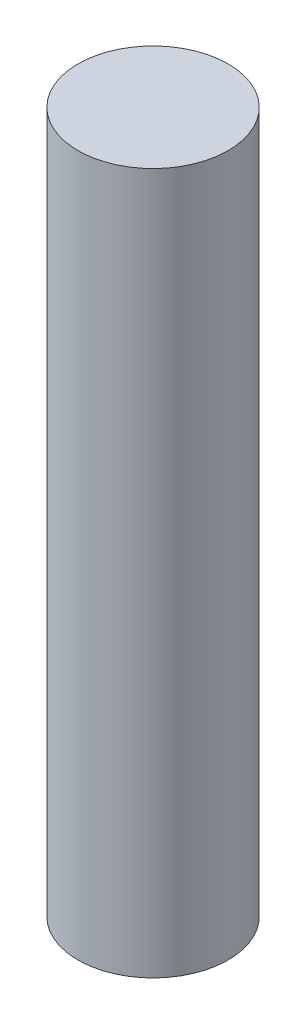
ISO-10303-21;
HEADER;
FILE_DESCRIPTION(('STEP AP214'),'2;1');
FILE_NAME('part.step','',(''),(''),'','','');
FILE_SCHEMA(('AUTOMOTIVE_DESIGN { 1 0 10303 214 1 1 1 1 }'));
ENDSEC;
DATA;
#1=APPLICATION_CONTEXT('core data for automotive mechanical design processes');
#2=APPLICATION_PROTOCOL_DEFINITION('international standard','automotive_design',2000,#1);
#3=PRODUCT_CONTEXT('',#1,'mechanical');
#4=PRODUCT('Part','Part','',(#3));
#5=PRODUCT_RELATED_PRODUCT_CATEGORY('part','',(#4));
#6=PRODUCT_DEFINITION_FORMATION('','',#4);
#7=PRODUCT_DEFINITION_CONTEXT('part definition',#1,'design');
#8=PRODUCT_DEFINITION('design','',#6,#7);
#9=PRODUCT_DEFINITION_SHAPE('','',#8);
#10=(LENGTH_UNIT() NAMED_UNIT(*) SI_UNIT(.MILLI.,.METRE.));
#11=(NAMED_UNIT(*) PLANE_ANGLE_UNIT() SI_UNIT($,.RADIAN.));
#12=(NAMED_UNIT(*) SI_UNIT($,.STERADIAN.) SOLID_ANGLE_UNIT());
#13=UNCERTAINTY_MEASURE_WITH_UNIT(LENGTH_MEASURE(1.E-05),#10,'distance_accuracy_value','');
#14=(GEOMETRIC_REPRESENTATION_CONTEXT(3) GLOBAL_UNCERTAINTY_ASSIGNED_CONTEXT((#13)) GLOBAL_UNIT_ASSIGNED_CONTEXT((#10,
#11,#12)) REPRESENTATION_CONTEXT('',''));
#15=CARTESIAN_POINT('',(0.,0.,0.));
#16=DIRECTION('',(0.,0.,1.));
#17=DIRECTION('',(1.,0.,0.));
#18=AXIS2_PLACEMENT_3D('',#15,#16,#17);
#19=CARTESIAN_POINT('',(0.,14.,0.));
#20=DIRECTION('',(0.,-1.,0.));
#21=DIRECTION('',(0.,0.,-1.));
#22=AXIS2_PLACEMENT_3D('',#19,#20,#21);
#23=PLANE('',#22);
#24=CARTESIAN_POINT('',(0.,14.,0.));
#25=DIRECTION('',(0.,-1.,0.));
#26=DIRECTION('',(0.,0.,-1.));
#27=AXIS2_PLACEMENT_3D('',#24,#25,#26);
#28=CIRCLE('',#27,1.5);
#29=CARTESIAN_POINT('',(0.,14.,-1.5));
#30=VERTEX_POINT('',#29);
#31=EDGE_CURVE('E10',#30,#30,#28,.T.);
#32=ORIENTED_EDGE('',*,*,#31,.F.);
#33=EDGE_LOOP('',(#32));
#34=FACE_BOUND('',#33,.T.);
#35=ADVANCED_FACE('F33',(#34),#23,.F.);
#36=CARTESIAN_POINT('',(0.,0.,0.));
#37=DIRECTION('',(0.,-1.,0.));
#38=DIRECTION('',(0.,0.,-1.));
#39=AXIS2_PLACEMENT_3D('',#36,#37,#38);
#40=CYLINDRICAL_SURFACE('',#39,1.5);
#41=CARTESIAN_POINT('',(0.,0.,0.));
#42=DIRECTION('',(0.,-1.,0.));
#43=DIRECTION('',(0.,0.,-1.));
#44=AXIS2_PLACEMENT_3D('',#41,#42,#43);
#45=CIRCLE('',#44,1.5);
#46=CARTESIAN_POINT('',(0.,0.,-1.5));
#47=VERTEX_POINT('',#46);
#48=EDGE_CURVE('E39',#47,#47,#45,.T.);
#49=ORIENTED_EDGE('',*,*,#48,.F.);
#50=EDGE_LOOP('',(#49));
#51=FACE_BOUND('',#50,.T.);
#52=ORIENTED_EDGE('',*,*,#31,.T.);
#53=EDGE_LOOP('',(#52));
#54=FACE_BOUND('',#53,.T.);
#55=ADVANCED_FACE('F47',(#51,#54),#40,.T.);
#56=CARTESIAN_POINT('',(0.,0.,0.));
#57=DIRECTION('',(0.,1.,0.));
#58=DIRECTION('',(0.,0.,1.));
#59=AXIS2_PLACEMENT_3D('',#56,#57,#58);
#60=PLANE('',#59);
#61=ORIENTED_EDGE('',*,*,#48,.T.);
#62=EDGE_LOOP('',(#61));
#63=FACE_BOUND('',#62,.T.);
#64=ADVANCED_FACE('F45',(#63),#60,.F.);
#65=CLOSED_SHELL('',(#35,#55,#64));
#66=MANIFOLD_SOLID_BREP('B2',#65);
#67=ADVANCED_BREP_SHAPE_REPRESENTATION('',(#18,#66),#14);
#68=SHAPE_DEFINITION_REPRESENTATION(#9,#67);
ENDSEC;
END-ISO-10303-21;
